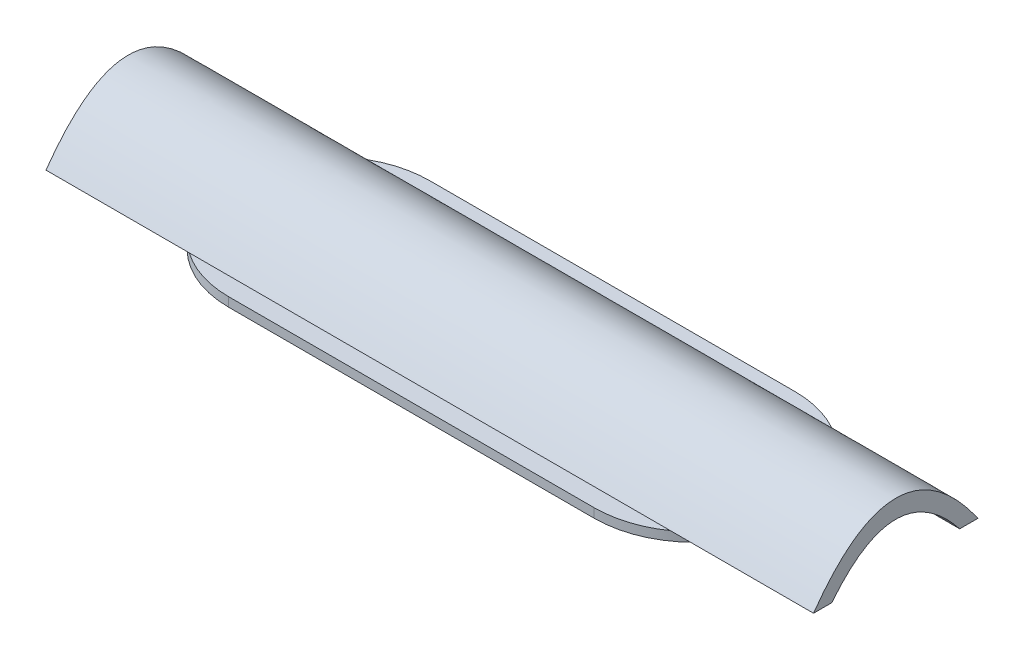
ISO-10303-21;
HEADER;
FILE_DESCRIPTION(('STEP AP214'),'2;1');
FILE_NAME('part.step','',(''),(''),'','','');
FILE_SCHEMA(('AUTOMOTIVE_DESIGN { 1 0 10303 214 1 1 1 1 }'));
ENDSEC;
DATA;
#1=APPLICATION_CONTEXT('core data for automotive mechanical design processes');
#2=APPLICATION_PROTOCOL_DEFINITION('international standard','automotive_design',2000,#1);
#3=PRODUCT_CONTEXT('',#1,'mechanical');
#4=PRODUCT('Part','Part','',(#3));
#5=PRODUCT_RELATED_PRODUCT_CATEGORY('part','',(#4));
#6=PRODUCT_DEFINITION_FORMATION('','',#4);
#7=PRODUCT_DEFINITION_CONTEXT('part definition',#1,'design');
#8=PRODUCT_DEFINITION('design','',#6,#7);
#9=PRODUCT_DEFINITION_SHAPE('','',#8);
#10=(LENGTH_UNIT() NAMED_UNIT(*) SI_UNIT(.MILLI.,.METRE.));
#11=(NAMED_UNIT(*) PLANE_ANGLE_UNIT() SI_UNIT($,.RADIAN.));
#12=(NAMED_UNIT(*) SI_UNIT($,.STERADIAN.) SOLID_ANGLE_UNIT());
#13=UNCERTAINTY_MEASURE_WITH_UNIT(LENGTH_MEASURE(1.E-05),#10,'distance_accuracy_value','');
#14=(GEOMETRIC_REPRESENTATION_CONTEXT(3) GLOBAL_UNCERTAINTY_ASSIGNED_CONTEXT((#13)) GLOBAL_UNIT_ASSIGNED_CONTEXT((#10,
#11,#12)) REPRESENTATION_CONTEXT('',''));
#15=CARTESIAN_POINT('',(0.,0.,0.));
#16=DIRECTION('',(0.,0.,1.));
#17=DIRECTION('',(1.,0.,0.));
#18=AXIS2_PLACEMENT_3D('',#15,#16,#17);
#19=CARTESIAN_POINT('',(-10.,0.5,0.));
#20=DIRECTION('',(0.,1.,0.));
#21=DIRECTION('',(0.,0.,1.));
#22=AXIS2_PLACEMENT_3D('',#19,#20,#21);
#23=PLANE('',#22);
#24=CARTESIAN_POINT('',(-10.,0.5,0.));
#25=DIRECTION('',(0.,1.,0.));
#26=DIRECTION('',(0.,0.,1.));
#27=AXIS2_PLACEMENT_3D('',#24,#25,#26);
#28=CIRCLE('',#27,5.5);
#29=CARTESIAN_POINT('',(-14.2426406871193,0.5,-3.5));
#30=VERTEX_POINT('',#29);
#31=CARTESIAN_POINT('',(-14.2426406871193,0.5,3.5));
#32=VERTEX_POINT('',#31);
#33=EDGE_CURVE('E319',#30,#32,#28,.T.);
#34=ORIENTED_EDGE('',*,*,#33,.T.);
#35=DIRECTION('',(1.,0.,0.));
#36=VECTOR('',#35,1.);
#37=CARTESIAN_POINT('',(-10.,0.5,3.5));
#38=LINE('',#37,#36);
#39=CARTESIAN_POINT('',(14.2426406871193,0.5,3.5));
#40=VERTEX_POINT('',#39);
#41=EDGE_CURVE('E409',#32,#40,#38,.T.);
#42=ORIENTED_EDGE('',*,*,#41,.T.);
#43=CARTESIAN_POINT('',(10.,0.5,0.));
#44=DIRECTION('',(0.,1.,0.));
#45=DIRECTION('',(0.,0.,1.));
#46=AXIS2_PLACEMENT_3D('',#43,#44,#45);
#47=CIRCLE('',#46,5.5);
#48=CARTESIAN_POINT('',(14.2426406871193,0.5,-3.5));
#49=VERTEX_POINT('',#48);
#50=EDGE_CURVE('E433',#40,#49,#47,.T.);
#51=ORIENTED_EDGE('',*,*,#50,.T.);
#52=DIRECTION('',(-1.,0.,0.));
#53=VECTOR('',#52,1.);
#54=CARTESIAN_POINT('',(-10.,0.5,-3.5));
#55=LINE('',#54,#53);
#56=EDGE_CURVE('E411',#49,#30,#55,.T.);
#57=ORIENTED_EDGE('',*,*,#56,.T.);
#58=EDGE_LOOP('',(#34,#42,#51,#57));
#59=FACE_BOUND('',#58,.T.);
#60=DIRECTION('',(-1.,0.,0.));
#61=VECTOR('',#60,1.);
#62=CARTESIAN_POINT('',(-10.,0.5,2.5));
#63=LINE('',#62,#61);
#64=CARTESIAN_POINT('',(10.,0.5,2.5));
#65=VERTEX_POINT('',#64);
#66=CARTESIAN_POINT('',(-10.,0.5,2.5));
#67=VERTEX_POINT('',#66);
#68=EDGE_CURVE('E197',#65,#67,#63,.T.);
#69=ORIENTED_EDGE('',*,*,#68,.T.);
#70=CARTESIAN_POINT('',(-10.,0.5,0.));
#71=DIRECTION('',(0.,-1.,0.));
#72=DIRECTION('',(0.,0.,-1.));
#73=AXIS2_PLACEMENT_3D('',#70,#71,#72);
#74=CIRCLE('',#73,2.5);
#75=CARTESIAN_POINT('',(-10.,0.5,-2.5));
#76=VERTEX_POINT('',#75);
#77=EDGE_CURVE('E227',#67,#76,#74,.T.);
#78=ORIENTED_EDGE('',*,*,#77,.T.);
#79=DIRECTION('',(1.,0.,0.));
#80=VECTOR('',#79,1.);
#81=CARTESIAN_POINT('',(-10.,0.5,-2.5));
#82=LINE('',#81,#80);
#83=CARTESIAN_POINT('',(10.,0.5,-2.49999999999999));
#84=VERTEX_POINT('',#83);
#85=EDGE_CURVE('E192',#76,#84,#82,.T.);
#86=ORIENTED_EDGE('',*,*,#85,.T.);
#87=CARTESIAN_POINT('',(10.,0.5,0.));
#88=DIRECTION('',(0.,-1.,0.));
#89=DIRECTION('',(0.,0.,-1.));
#90=AXIS2_PLACEMENT_3D('',#87,#88,#89);
#91=CIRCLE('',#90,2.5);
#92=EDGE_CURVE('E230',#84,#65,#91,.T.);
#93=ORIENTED_EDGE('',*,*,#92,.T.);
#94=EDGE_LOOP('',(#69,#78,#86,#93));
#95=FACE_BOUND('',#94,.T.);
#96=ADVANCED_FACE('F35',(#59,#95),#23,.T.);
#97=DIRECTION('',(1.,0.,0.));
#98=VECTOR('',#97,1.);
#99=CARTESIAN_POINT('',(-21.,0.5,-4.5));
#100=LINE('',#99,#98);
#101=CARTESIAN_POINT('',(-13.1622776601684,0.5,-4.5));
#102=VERTEX_POINT('',#101);
#103=CARTESIAN_POINT('',(13.1622776601684,0.5,-4.5));
#104=VERTEX_POINT('',#103);
#105=EDGE_CURVE('E392',#102,#104,#100,.T.);
#106=ORIENTED_EDGE('',*,*,#105,.T.);
#107=CARTESIAN_POINT('',(10.,0.5,-5.5));
#108=VERTEX_POINT('',#107);
#109=EDGE_CURVE('E429',#104,#108,#47,.T.);
#110=ORIENTED_EDGE('',*,*,#109,.T.);
#111=DIRECTION('',(-1.,0.,0.));
#112=VECTOR('',#111,1.);
#113=CARTESIAN_POINT('',(-10.,0.5,-5.5));
#114=LINE('',#113,#112);
#115=CARTESIAN_POINT('',(-10.,0.5,-5.5));
#116=VERTEX_POINT('',#115);
#117=EDGE_CURVE('E52',#108,#116,#114,.T.);
#118=ORIENTED_EDGE('',*,*,#117,.T.);
#119=EDGE_CURVE('E425',#116,#102,#28,.T.);
#120=ORIENTED_EDGE('',*,*,#119,.T.);
#121=EDGE_LOOP('',(#106,#110,#118,#120));
#122=FACE_BOUND('',#121,.T.);
#123=ADVANCED_FACE('F294',(#122),#23,.T.);
#124=DIRECTION('',(1.,0.,0.));
#125=VECTOR('',#124,1.);
#126=CARTESIAN_POINT('',(-21.,0.5,4.5));
#127=LINE('',#126,#125);
#128=CARTESIAN_POINT('',(-13.1622776601684,0.5,4.5));
#129=VERTEX_POINT('',#128);
#130=CARTESIAN_POINT('',(13.1622776601684,0.5,4.5));
#131=VERTEX_POINT('',#130);
#132=EDGE_CURVE('E387',#129,#131,#127,.T.);
#133=ORIENTED_EDGE('',*,*,#132,.F.);
#134=CARTESIAN_POINT('',(-10.,0.5,5.5));
#135=VERTEX_POINT('',#134);
#136=EDGE_CURVE('E84',#129,#135,#28,.T.);
#137=ORIENTED_EDGE('',*,*,#136,.T.);
#138=DIRECTION('',(1.,0.,0.));
#139=VECTOR('',#138,1.);
#140=CARTESIAN_POINT('',(-10.,0.5,5.5));
#141=LINE('',#140,#139);
#142=CARTESIAN_POINT('',(10.,0.5,5.5));
#143=VERTEX_POINT('',#142);
#144=EDGE_CURVE('E427',#135,#143,#141,.T.);
#145=ORIENTED_EDGE('',*,*,#144,.T.);
#146=EDGE_CURVE('E430',#143,#131,#47,.T.);
#147=ORIENTED_EDGE('',*,*,#146,.T.);
#148=EDGE_LOOP('',(#133,#137,#145,#147));
#149=FACE_BOUND('',#148,.T.);
#150=ADVANCED_FACE('F290',(#149),#23,.T.);
#151=CARTESIAN_POINT('',(-10.,0.,0.));
#152=DIRECTION('',(0.,1.,0.));
#153=DIRECTION('',(0.,0.,1.));
#154=AXIS2_PLACEMENT_3D('',#151,#152,#153);
#155=PLANE('',#154);
#156=CARTESIAN_POINT('',(-10.,0.,0.));
#157=DIRECTION('',(0.,1.,0.));
#158=DIRECTION('',(0.,0.,1.));
#159=AXIS2_PLACEMENT_3D('',#156,#157,#158);
#160=CIRCLE('',#159,5.5);
#161=CARTESIAN_POINT('',(-10.,0.,-5.5));
#162=VERTEX_POINT('',#161);
#163=CARTESIAN_POINT('',(-10.,0.,5.5));
#164=VERTEX_POINT('',#163);
#165=EDGE_CURVE('E414',#162,#164,#160,.T.);
#166=ORIENTED_EDGE('',*,*,#165,.F.);
#167=DIRECTION('',(-1.,0.,0.));
#168=VECTOR('',#167,1.);
#169=CARTESIAN_POINT('',(-10.,0.,-5.5));
#170=LINE('',#169,#168);
#171=CARTESIAN_POINT('',(10.,0.,-5.5));
#172=VERTEX_POINT('',#171);
#173=EDGE_CURVE('E76',#172,#162,#170,.T.);
#174=ORIENTED_EDGE('',*,*,#173,.F.);
#175=CARTESIAN_POINT('',(10.,0.,0.));
#176=DIRECTION('',(0.,1.,0.));
#177=DIRECTION('',(0.,0.,1.));
#178=AXIS2_PLACEMENT_3D('',#175,#176,#177);
#179=CIRCLE('',#178,5.5);
#180=CARTESIAN_POINT('',(10.,0.,5.5));
#181=VERTEX_POINT('',#180);
#182=EDGE_CURVE('E70',#181,#172,#179,.T.);
#183=ORIENTED_EDGE('',*,*,#182,.F.);
#184=DIRECTION('',(1.,0.,0.));
#185=VECTOR('',#184,1.);
#186=CARTESIAN_POINT('',(-10.,0.,5.5));
#187=LINE('',#186,#185);
#188=EDGE_CURVE('E438',#164,#181,#187,.T.);
#189=ORIENTED_EDGE('',*,*,#188,.F.);
#190=EDGE_LOOP('',(#166,#174,#183,#189));
#191=FACE_BOUND('',#190,.T.);
#192=CARTESIAN_POINT('',(-10.,0.,0.));
#193=DIRECTION('',(0.,1.,0.));
#194=DIRECTION('',(0.,0.,1.));
#195=AXIS2_PLACEMENT_3D('',#192,#193,#194);
#196=CIRCLE('',#195,3.5);
#197=CARTESIAN_POINT('',(-10.,0.,-3.50000000000001));
#198=VERTEX_POINT('',#197);
#199=CARTESIAN_POINT('',(-10.,0.,3.50000000000001));
#200=VERTEX_POINT('',#199);
#201=EDGE_CURVE('E408',#198,#200,#196,.T.);
#202=ORIENTED_EDGE('',*,*,#201,.T.);
#203=DIRECTION('',(1.,0.,0.));
#204=VECTOR('',#203,1.);
#205=CARTESIAN_POINT('',(-10.,0.,3.5));
#206=LINE('',#205,#204);
#207=CARTESIAN_POINT('',(10.,0.,3.5));
#208=VERTEX_POINT('',#207);
#209=EDGE_CURVE('E417',#200,#208,#206,.T.);
#210=ORIENTED_EDGE('',*,*,#209,.T.);
#211=CARTESIAN_POINT('',(10.,0.,0.));
#212=DIRECTION('',(0.,1.,0.));
#213=DIRECTION('',(0.,0.,1.));
#214=AXIS2_PLACEMENT_3D('',#211,#212,#213);
#215=CIRCLE('',#214,3.5);
#216=CARTESIAN_POINT('',(10.,0.,-3.50000000000001));
#217=VERTEX_POINT('',#216);
#218=EDGE_CURVE('E420',#208,#217,#215,.T.);
#219=ORIENTED_EDGE('',*,*,#218,.T.);
#220=DIRECTION('',(-1.,0.,0.));
#221=VECTOR('',#220,1.);
#222=CARTESIAN_POINT('',(-10.,0.,-3.5));
#223=LINE('',#222,#221);
#224=EDGE_CURVE('E412',#217,#198,#223,.T.);
#225=ORIENTED_EDGE('',*,*,#224,.T.);
#226=EDGE_LOOP('',(#202,#210,#219,#225));
#227=FACE_BOUND('',#226,.T.);
#228=ADVANCED_FACE('F293',(#191,#227),#155,.F.);
#229=CARTESIAN_POINT('',(-10.,0.5,0.));
#230=DIRECTION('',(0.,-1.,0.));
#231=DIRECTION('',(0.,0.,-1.));
#232=AXIS2_PLACEMENT_3D('',#229,#230,#231);
#233=CYLINDRICAL_SURFACE('',#232,5.5);
#234=ORIENTED_EDGE('',*,*,#165,.T.);
#235=DIRECTION('',(0.,-1.,0.));
#236=VECTOR('',#235,1.);
#237=CARTESIAN_POINT('',(-10.,0.5,5.5));
#238=LINE('',#237,#236);
#239=EDGE_CURVE('E11',#135,#164,#238,.T.);
#240=ORIENTED_EDGE('',*,*,#239,.F.);
#241=ORIENTED_EDGE('',*,*,#136,.F.);
#242=CARTESIAN_POINT('',(-10.,0.5,0.));
#243=DIRECTION('',(0.,-1.,0.));
#244=DIRECTION('',(0.,0.,-1.));
#245=AXIS2_PLACEMENT_3D('',#242,#243,#244);
#246=CIRCLE('',#245,5.5);
#247=EDGE_CURVE('E405',#129,#32,#246,.T.);
#248=ORIENTED_EDGE('',*,*,#247,.T.);
#249=ORIENTED_EDGE('',*,*,#33,.F.);
#250=CARTESIAN_POINT('',(-10.,0.5,0.));
#251=DIRECTION('',(0.,-1.,0.));
#252=DIRECTION('',(0.,0.,-1.));
#253=AXIS2_PLACEMENT_3D('',#250,#251,#252);
#254=CIRCLE('',#253,5.5);
#255=EDGE_CURVE('E399',#30,#102,#254,.T.);
#256=ORIENTED_EDGE('',*,*,#255,.T.);
#257=ORIENTED_EDGE('',*,*,#119,.F.);
#258=DIRECTION('',(0.,-1.,0.));
#259=VECTOR('',#258,1.);
#260=CARTESIAN_POINT('',(-10.,0.5,-5.5));
#261=LINE('',#260,#259);
#262=EDGE_CURVE('E435',#116,#162,#261,.T.);
#263=ORIENTED_EDGE('',*,*,#262,.T.);
#264=EDGE_LOOP('',(#234,#240,#241,#248,#249,#256,#257,#263));
#265=FACE_BOUND('',#264,.T.);
#266=ADVANCED_FACE('F37',(#265),#233,.T.);
#267=CARTESIAN_POINT('',(-10.,0.5,5.5));
#268=DIRECTION('',(0.,0.,-1.));
#269=DIRECTION('',(-1.,0.,0.));
#270=AXIS2_PLACEMENT_3D('',#267,#268,#269);
#271=PLANE('',#270);
#272=ORIENTED_EDGE('',*,*,#188,.T.);
#273=DIRECTION('',(0.,-1.,0.));
#274=VECTOR('',#273,1.);
#275=CARTESIAN_POINT('',(10.,0.5,5.5));
#276=LINE('',#275,#274);
#277=EDGE_CURVE('E44',#143,#181,#276,.T.);
#278=ORIENTED_EDGE('',*,*,#277,.F.);
#279=ORIENTED_EDGE('',*,*,#144,.F.);
#280=ORIENTED_EDGE('',*,*,#239,.T.);
#281=EDGE_LOOP('',(#272,#278,#279,#280));
#282=FACE_BOUND('',#281,.T.);
#283=ADVANCED_FACE('F304',(#282),#271,.F.);
#284=CARTESIAN_POINT('',(10.,0.5,0.));
#285=DIRECTION('',(0.,-1.,0.));
#286=DIRECTION('',(0.,0.,-1.));
#287=AXIS2_PLACEMENT_3D('',#284,#285,#286);
#288=CYLINDRICAL_SURFACE('',#287,5.5);
#289=ORIENTED_EDGE('',*,*,#182,.T.);
#290=DIRECTION('',(0.,-1.,0.));
#291=VECTOR('',#290,1.);
#292=CARTESIAN_POINT('',(10.,0.5,-5.5));
#293=LINE('',#292,#291);
#294=EDGE_CURVE('E443',#108,#172,#293,.T.);
#295=ORIENTED_EDGE('',*,*,#294,.F.);
#296=ORIENTED_EDGE('',*,*,#109,.F.);
#297=CARTESIAN_POINT('',(10.,0.5,0.));
#298=DIRECTION('',(0.,-1.,0.));
#299=DIRECTION('',(0.,0.,-1.));
#300=AXIS2_PLACEMENT_3D('',#297,#298,#299);
#301=CIRCLE('',#300,5.5);
#302=EDGE_CURVE('E382',#104,#49,#301,.T.);
#303=ORIENTED_EDGE('',*,*,#302,.T.);
#304=ORIENTED_EDGE('',*,*,#50,.F.);
#305=CARTESIAN_POINT('',(10.,0.5,0.));
#306=DIRECTION('',(0.,-1.,0.));
#307=DIRECTION('',(0.,0.,-1.));
#308=AXIS2_PLACEMENT_3D('',#305,#306,#307);
#309=CIRCLE('',#308,5.5);
#310=EDGE_CURVE('E402',#40,#131,#309,.T.);
#311=ORIENTED_EDGE('',*,*,#310,.T.);
#312=ORIENTED_EDGE('',*,*,#146,.F.);
#313=ORIENTED_EDGE('',*,*,#277,.T.);
#314=EDGE_LOOP('',(#289,#295,#296,#303,#304,#311,#312,#313));
#315=FACE_BOUND('',#314,.T.);
#316=ADVANCED_FACE('F302',(#315),#288,.T.);
#317=CARTESIAN_POINT('',(-10.,0.5,-5.5));
#318=DIRECTION('',(0.,0.,1.));
#319=DIRECTION('',(1.,0.,0.));
#320=AXIS2_PLACEMENT_3D('',#317,#318,#319);
#321=PLANE('',#320);
#322=ORIENTED_EDGE('',*,*,#173,.T.);
#323=ORIENTED_EDGE('',*,*,#262,.F.);
#324=ORIENTED_EDGE('',*,*,#117,.F.);
#325=ORIENTED_EDGE('',*,*,#294,.T.);
#326=EDGE_LOOP('',(#322,#323,#324,#325));
#327=FACE_BOUND('',#326,.T.);
#328=ADVANCED_FACE('F298',(#327),#321,.F.);
#329=CARTESIAN_POINT('',(-21.,0.5,4.5));
#330=DIRECTION('',(0.,-1.,0.));
#331=DIRECTION('',(0.,0.,-1.));
#332=AXIS2_PLACEMENT_3D('',#329,#330,#331);
#333=PLANE('',#332);
#334=ORIENTED_EDGE('',*,*,#247,.F.);
#335=CARTESIAN_POINT('',(-21.,0.5,4.5));
#336=VERTEX_POINT('',#335);
#337=EDGE_CURVE('E384',#336,#129,#127,.T.);
#338=ORIENTED_EDGE('',*,*,#337,.F.);
#339=DIRECTION('',(0.,0.,-1.));
#340=VECTOR('',#339,1.);
#341=CARTESIAN_POINT('',(-21.,0.5,4.5));
#342=LINE('',#341,#340);
#343=CARTESIAN_POINT('',(-21.,0.5,3.5));
#344=VERTEX_POINT('',#343);
#345=EDGE_CURVE('E372',#336,#344,#342,.T.);
#346=ORIENTED_EDGE('',*,*,#345,.T.);
#347=DIRECTION('',(1.,0.,0.));
#348=VECTOR('',#347,1.);
#349=CARTESIAN_POINT('',(-21.,0.5,3.5));
#350=LINE('',#349,#348);
#351=EDGE_CURVE('E379',#344,#32,#350,.T.);
#352=ORIENTED_EDGE('',*,*,#351,.T.);
#353=EDGE_LOOP('',(#334,#338,#346,#352));
#354=FACE_BOUND('',#353,.T.);
#355=ADVANCED_FACE('F301',(#354),#333,.T.);
#356=CARTESIAN_POINT('',(-21.,0.5,-3.5));
#357=DIRECTION('',(0.,-1.,0.));
#358=DIRECTION('',(0.,0.,-1.));
#359=AXIS2_PLACEMENT_3D('',#356,#357,#358);
#360=PLANE('',#359);
#361=ORIENTED_EDGE('',*,*,#255,.F.);
#362=DIRECTION('',(1.,0.,0.));
#363=VECTOR('',#362,1.);
#364=CARTESIAN_POINT('',(-21.,0.5,-3.5));
#365=LINE('',#364,#363);
#366=CARTESIAN_POINT('',(-21.,0.5,-3.5));
#367=VERTEX_POINT('',#366);
#368=EDGE_CURVE('E394',#367,#30,#365,.T.);
#369=ORIENTED_EDGE('',*,*,#368,.F.);
#370=DIRECTION('',(0.,0.,-1.));
#371=VECTOR('',#370,1.);
#372=CARTESIAN_POINT('',(-21.,0.5,-3.5));
#373=LINE('',#372,#371);
#374=CARTESIAN_POINT('',(-21.,0.5,-4.5));
#375=VERTEX_POINT('',#374);
#376=EDGE_CURVE('E275',#367,#375,#373,.T.);
#377=ORIENTED_EDGE('',*,*,#376,.T.);
#378=EDGE_CURVE('E389',#375,#102,#100,.T.);
#379=ORIENTED_EDGE('',*,*,#378,.T.);
#380=EDGE_LOOP('',(#361,#369,#377,#379));
#381=FACE_BOUND('',#380,.T.);
#382=ADVANCED_FACE('F288',(#381),#360,.T.);
#383=ORIENTED_EDGE('',*,*,#302,.F.);
#384=CARTESIAN_POINT('',(21.,0.5,-4.5));
#385=VERTEX_POINT('',#384);
#386=EDGE_CURVE('E393',#104,#385,#100,.T.);
#387=ORIENTED_EDGE('',*,*,#386,.T.);
#388=DIRECTION('',(0.,0.,-1.));
#389=VECTOR('',#388,1.);
#390=CARTESIAN_POINT('',(21.,0.5,-3.5));
#391=LINE('',#390,#389);
#392=CARTESIAN_POINT('',(21.,0.5,-3.5));
#393=VERTEX_POINT('',#392);
#394=EDGE_CURVE('E252',#393,#385,#391,.T.);
#395=ORIENTED_EDGE('',*,*,#394,.F.);
#396=EDGE_CURVE('E378',#49,#393,#365,.T.);
#397=ORIENTED_EDGE('',*,*,#396,.F.);
#398=EDGE_LOOP('',(#383,#387,#395,#397));
#399=FACE_BOUND('',#398,.T.);
#400=ADVANCED_FACE('F286',(#399),#360,.T.);
#401=CARTESIAN_POINT('',(-21.,0.5,3.5));
#402=CARTESIAN_POINT('',(-21.,4.90672822005873,0.000733785995191863));
#403=CARTESIAN_POINT('',(-21.,0.5,-3.5));
#404=B_SPLINE_CURVE_WITH_KNOTS('',2,(#401,#402,#403),.UNSPECIFIED.,.F.,.F.,(3,3),(0.,1.),.UNSPECIFIED.);
#405=DIRECTION('',(1.,0.,0.));
#406=VECTOR('',#405,1.);
#407=SURFACE_OF_LINEAR_EXTRUSION('',#404,#406);
#408=ORIENTED_EDGE('',*,*,#368,.T.);
#409=ORIENTED_EDGE('',*,*,#56,.F.);
#410=ORIENTED_EDGE('',*,*,#396,.T.);
#411=CARTESIAN_POINT('',(21.,0.5,3.5));
#412=CARTESIAN_POINT('',(21.,4.90672822005873,0.000733785995191863));
#413=CARTESIAN_POINT('',(21.,0.5,-3.5));
#414=B_SPLINE_CURVE_WITH_KNOTS('',2,(#411,#412,#413),.UNSPECIFIED.,.F.,.F.,(3,3),(0.,1.),.UNSPECIFIED.);
#415=CARTESIAN_POINT('',(21.,0.5,3.5));
#416=VERTEX_POINT('',#415);
#417=EDGE_CURVE('E242',#416,#393,#414,.T.);
#418=ORIENTED_EDGE('',*,*,#417,.F.);
#419=EDGE_CURVE('E383',#40,#416,#350,.T.);
#420=ORIENTED_EDGE('',*,*,#419,.F.);
#421=ORIENTED_EDGE('',*,*,#41,.F.);
#422=ORIENTED_EDGE('',*,*,#351,.F.);
#423=EDGE_CURVE('E269',#344,#367,#404,.T.);
#424=ORIENTED_EDGE('',*,*,#423,.T.);
#425=EDGE_LOOP('',(#408,#409,#410,#418,#420,#421,#422,#424));
#426=FACE_BOUND('',#425,.T.);
#427=ADVANCED_FACE('F281',(#426),#407,.T.);
#428=ORIENTED_EDGE('',*,*,#310,.F.);
#429=ORIENTED_EDGE('',*,*,#419,.T.);
#430=DIRECTION('',(0.,0.,-1.));
#431=VECTOR('',#430,1.);
#432=CARTESIAN_POINT('',(21.,0.5,4.5));
#433=LINE('',#432,#431);
#434=CARTESIAN_POINT('',(21.,0.5,4.5));
#435=VERTEX_POINT('',#434);
#436=EDGE_CURVE('E263',#435,#416,#433,.T.);
#437=ORIENTED_EDGE('',*,*,#436,.F.);
#438=EDGE_CURVE('E388',#131,#435,#127,.T.);
#439=ORIENTED_EDGE('',*,*,#438,.F.);
#440=EDGE_LOOP('',(#428,#429,#437,#439));
#441=FACE_BOUND('',#440,.T.);
#442=ADVANCED_FACE('F285',(#441),#333,.T.);
#443=CARTESIAN_POINT('',(-21.,0.5,-4.5));
#444=CARTESIAN_POINT('',(-21.,6.90674136313797,-0.0104555936665669));
#445=CARTESIAN_POINT('',(-21.,0.5,4.5));
#446=B_SPLINE_CURVE_WITH_KNOTS('',2,(#443,#444,#445),.UNSPECIFIED.,.F.,.F.,(3,3),(0.,1.),.UNSPECIFIED.);
#447=DIRECTION('',(1.,0.,0.));
#448=VECTOR('',#447,1.);
#449=SURFACE_OF_LINEAR_EXTRUSION('',#446,#448);
#450=ORIENTED_EDGE('',*,*,#337,.T.);
#451=ORIENTED_EDGE('',*,*,#132,.T.);
#452=ORIENTED_EDGE('',*,*,#438,.T.);
#453=CARTESIAN_POINT('',(21.,0.5,-4.5));
#454=CARTESIAN_POINT('',(21.,6.90674136313797,-0.0104555936665669));
#455=CARTESIAN_POINT('',(21.,0.5,4.5));
#456=B_SPLINE_CURVE_WITH_KNOTS('',2,(#453,#454,#455),.UNSPECIFIED.,.F.,.F.,(3,3),(0.,1.),.UNSPECIFIED.);
#457=EDGE_CURVE('E258',#385,#435,#456,.T.);
#458=ORIENTED_EDGE('',*,*,#457,.F.);
#459=ORIENTED_EDGE('',*,*,#386,.F.);
#460=ORIENTED_EDGE('',*,*,#105,.F.);
#461=ORIENTED_EDGE('',*,*,#378,.F.);
#462=EDGE_CURVE('E366',#375,#336,#446,.T.);
#463=ORIENTED_EDGE('',*,*,#462,.T.);
#464=EDGE_LOOP('',(#450,#451,#452,#458,#459,#460,#461,#463));
#465=FACE_BOUND('',#464,.T.);
#466=ADVANCED_FACE('F360',(#465),#449,.T.);
#467=CARTESIAN_POINT('',(-21.,2.70336411002936,0.000366892997595916));
#468=DIRECTION('',(1.,0.,0.));
#469=DIRECTION('',(0.,0.,-1.));
#470=AXIS2_PLACEMENT_3D('',#467,#468,#469);
#471=PLANE('',#470);
#472=ORIENTED_EDGE('',*,*,#423,.F.);
#473=ORIENTED_EDGE('',*,*,#345,.F.);
#474=ORIENTED_EDGE('',*,*,#462,.F.);
#475=ORIENTED_EDGE('',*,*,#376,.F.);
#476=EDGE_LOOP('',(#472,#473,#474,#475));
#477=FACE_BOUND('',#476,.T.);
#478=ADVANCED_FACE('F356',(#477),#471,.F.);
#479=CARTESIAN_POINT('',(21.,2.70336411002936,0.000366892997595916));
#480=DIRECTION('',(1.,0.,0.));
#481=DIRECTION('',(0.,0.,-1.));
#482=AXIS2_PLACEMENT_3D('',#479,#480,#481);
#483=PLANE('',#482);
#484=ORIENTED_EDGE('',*,*,#417,.T.);
#485=ORIENTED_EDGE('',*,*,#394,.T.);
#486=ORIENTED_EDGE('',*,*,#457,.T.);
#487=ORIENTED_EDGE('',*,*,#436,.T.);
#488=EDGE_LOOP('',(#484,#485,#486,#487));
#489=FACE_BOUND('',#488,.T.);
#490=ADVANCED_FACE('F352',(#489),#483,.T.);
#491=CARTESIAN_POINT('',(10.,0.5,0.));
#492=DIRECTION('',(0.,-1.,0.));
#493=DIRECTION('',(0.,0.,-1.));
#494=AXIS2_PLACEMENT_3D('',#491,#492,#493);
#495=CYLINDRICAL_SURFACE('',#494,3.5);
#496=ORIENTED_EDGE('',*,*,#218,.F.);
#497=DIRECTION('',(0.,-1.,0.));
#498=VECTOR('',#497,1.);
#499=CARTESIAN_POINT('',(10.,0.5,3.5));
#500=LINE('',#499,#498);
#501=CARTESIAN_POINT('',(10.,-1.,3.5));
#502=VERTEX_POINT('',#501);
#503=EDGE_CURVE('E236',#208,#502,#500,.T.);
#504=ORIENTED_EDGE('',*,*,#503,.T.);
#505=CARTESIAN_POINT('',(10.,-1.,0.));
#506=DIRECTION('',(0.,-1.,0.));
#507=DIRECTION('',(0.,0.,-1.));
#508=AXIS2_PLACEMENT_3D('',#505,#506,#507);
#509=CIRCLE('',#508,3.5);
#510=CARTESIAN_POINT('',(10.,-1.,-3.50000000000001));
#511=VERTEX_POINT('',#510);
#512=EDGE_CURVE('E215',#511,#502,#509,.T.);
#513=ORIENTED_EDGE('',*,*,#512,.F.);
#514=DIRECTION('',(0.,-1.,0.));
#515=VECTOR('',#514,1.);
#516=CARTESIAN_POINT('',(10.,0.5,-3.50000000000001));
#517=LINE('',#516,#515);
#518=EDGE_CURVE('E240',#217,#511,#517,.T.);
#519=ORIENTED_EDGE('',*,*,#518,.F.);
#520=EDGE_LOOP('',(#496,#504,#513,#519));
#521=FACE_BOUND('',#520,.T.);
#522=ADVANCED_FACE('F342',(#521),#495,.T.);
#523=CARTESIAN_POINT('',(10.,0.5,-3.50000000000001));
#524=DIRECTION('',(0.,0.,-1.));
#525=DIRECTION('',(-1.,0.,0.));
#526=AXIS2_PLACEMENT_3D('',#523,#524,#525);
#527=PLANE('',#526);
#528=ORIENTED_EDGE('',*,*,#224,.F.);
#529=ORIENTED_EDGE('',*,*,#518,.T.);
#530=DIRECTION('',(1.,0.,0.));
#531=VECTOR('',#530,1.);
#532=CARTESIAN_POINT('',(10.,-1.,-3.50000000000001));
#533=LINE('',#532,#531);
#534=CARTESIAN_POINT('',(-10.,-1.,-3.50000000000001));
#535=VERTEX_POINT('',#534);
#536=EDGE_CURVE('E224',#535,#511,#533,.T.);
#537=ORIENTED_EDGE('',*,*,#536,.F.);
#538=DIRECTION('',(0.,-1.,0.));
#539=VECTOR('',#538,1.);
#540=CARTESIAN_POINT('',(-10.,0.5,-3.50000000000001));
#541=LINE('',#540,#539);
#542=EDGE_CURVE('E243',#198,#535,#541,.T.);
#543=ORIENTED_EDGE('',*,*,#542,.F.);
#544=EDGE_LOOP('',(#528,#529,#537,#543));
#545=FACE_BOUND('',#544,.T.);
#546=ADVANCED_FACE('F338',(#545),#527,.T.);
#547=CARTESIAN_POINT('',(-10.,0.5,0.));
#548=DIRECTION('',(0.,-1.,0.));
#549=DIRECTION('',(0.,0.,-1.));
#550=AXIS2_PLACEMENT_3D('',#547,#548,#549);
#551=CYLINDRICAL_SURFACE('',#550,3.5);
#552=ORIENTED_EDGE('',*,*,#201,.F.);
#553=ORIENTED_EDGE('',*,*,#542,.T.);
#554=CARTESIAN_POINT('',(-10.,-1.,0.));
#555=DIRECTION('',(0.,-1.,0.));
#556=DIRECTION('',(0.,0.,-1.));
#557=AXIS2_PLACEMENT_3D('',#554,#555,#556);
#558=CIRCLE('',#557,3.5);
#559=CARTESIAN_POINT('',(-10.,-1.,3.50000000000001));
#560=VERTEX_POINT('',#559);
#561=EDGE_CURVE('E221',#560,#535,#558,.T.);
#562=ORIENTED_EDGE('',*,*,#561,.F.);
#563=DIRECTION('',(0.,-1.,0.));
#564=VECTOR('',#563,1.);
#565=CARTESIAN_POINT('',(-10.,0.5,3.50000000000001));
#566=LINE('',#565,#564);
#567=EDGE_CURVE('E245',#200,#560,#566,.T.);
#568=ORIENTED_EDGE('',*,*,#567,.F.);
#569=EDGE_LOOP('',(#552,#553,#562,#568));
#570=FACE_BOUND('',#569,.T.);
#571=ADVANCED_FACE('F341',(#570),#551,.T.);
#572=CARTESIAN_POINT('',(10.,0.5,3.5));
#573=DIRECTION('',(0.,0.,1.));
#574=DIRECTION('',(1.,0.,0.));
#575=AXIS2_PLACEMENT_3D('',#572,#573,#574);
#576=PLANE('',#575);
#577=ORIENTED_EDGE('',*,*,#209,.F.);
#578=ORIENTED_EDGE('',*,*,#567,.T.);
#579=DIRECTION('',(-1.,0.,0.));
#580=VECTOR('',#579,1.);
#581=CARTESIAN_POINT('',(10.,-1.,3.5));
#582=LINE('',#581,#580);
#583=EDGE_CURVE('E218',#502,#560,#582,.T.);
#584=ORIENTED_EDGE('',*,*,#583,.F.);
#585=ORIENTED_EDGE('',*,*,#503,.F.);
#586=EDGE_LOOP('',(#577,#578,#584,#585));
#587=FACE_BOUND('',#586,.T.);
#588=ADVANCED_FACE('F337',(#587),#576,.T.);
#589=CARTESIAN_POINT('',(-10.,0.5,0.));
#590=DIRECTION('',(0.,-1.,0.));
#591=DIRECTION('',(0.,0.,-1.));
#592=AXIS2_PLACEMENT_3D('',#589,#590,#591);
#593=CYLINDRICAL_SURFACE('',#592,2.5);
#594=DIRECTION('',(0.,-1.,0.));
#595=VECTOR('',#594,1.);
#596=CARTESIAN_POINT('',(-10.,0.5,2.5));
#597=LINE('',#596,#595);
#598=CARTESIAN_POINT('',(-10.,-1.,2.5));
#599=VERTEX_POINT('',#598);
#600=EDGE_CURVE('E202',#67,#599,#597,.T.);
#601=ORIENTED_EDGE('',*,*,#600,.T.);
#602=CARTESIAN_POINT('',(-10.,-1.,0.));
#603=DIRECTION('',(0.,-1.,0.));
#604=DIRECTION('',(0.,0.,-1.));
#605=AXIS2_PLACEMENT_3D('',#602,#603,#604);
#606=CIRCLE('',#605,2.5);
#607=CARTESIAN_POINT('',(-10.,-1.,-2.5));
#608=VERTEX_POINT('',#607);
#609=EDGE_CURVE('E200',#599,#608,#606,.T.);
#610=ORIENTED_EDGE('',*,*,#609,.T.);
#611=DIRECTION('',(0.,-1.,0.));
#612=VECTOR('',#611,1.);
#613=CARTESIAN_POINT('',(-10.,0.5,-2.5));
#614=LINE('',#613,#612);
#615=EDGE_CURVE('E184',#76,#608,#614,.T.);
#616=ORIENTED_EDGE('',*,*,#615,.F.);
#617=ORIENTED_EDGE('',*,*,#77,.F.);
#618=EDGE_LOOP('',(#601,#610,#616,#617));
#619=FACE_BOUND('',#618,.T.);
#620=ADVANCED_FACE('F201',(#619),#593,.F.);
#621=CARTESIAN_POINT('',(-10.,0.5,2.5));
#622=DIRECTION('',(0.,0.,1.));
#623=DIRECTION('',(1.,0.,0.));
#624=AXIS2_PLACEMENT_3D('',#621,#622,#623);
#625=PLANE('',#624);
#626=DIRECTION('',(0.,-1.,0.));
#627=VECTOR('',#626,1.);
#628=CARTESIAN_POINT('',(10.,0.5,2.5));
#629=LINE('',#628,#627);
#630=CARTESIAN_POINT('',(10.,-1.,2.5));
#631=VERTEX_POINT('',#630);
#632=EDGE_CURVE('E237',#65,#631,#629,.T.);
#633=ORIENTED_EDGE('',*,*,#632,.T.);
#634=DIRECTION('',(-1.,0.,0.));
#635=VECTOR('',#634,1.);
#636=CARTESIAN_POINT('',(-10.,-1.,2.5));
#637=LINE('',#636,#635);
#638=EDGE_CURVE('E211',#631,#599,#637,.T.);
#639=ORIENTED_EDGE('',*,*,#638,.T.);
#640=ORIENTED_EDGE('',*,*,#600,.F.);
#641=ORIENTED_EDGE('',*,*,#68,.F.);
#642=EDGE_LOOP('',(#633,#639,#640,#641));
#643=FACE_BOUND('',#642,.T.);
#644=ADVANCED_FACE('F322',(#643),#625,.F.);
#645=CARTESIAN_POINT('',(10.,0.5,0.));
#646=DIRECTION('',(0.,-1.,0.));
#647=DIRECTION('',(0.,0.,-1.));
#648=AXIS2_PLACEMENT_3D('',#645,#646,#647);
#649=CYLINDRICAL_SURFACE('',#648,2.5);
#650=DIRECTION('',(0.,-1.,0.));
#651=VECTOR('',#650,1.);
#652=CARTESIAN_POINT('',(10.,0.5,-2.49999999999999));
#653=LINE('',#652,#651);
#654=CARTESIAN_POINT('',(10.,-1.,-2.49999999999999));
#655=VERTEX_POINT('',#654);
#656=EDGE_CURVE('E196',#84,#655,#653,.T.);
#657=ORIENTED_EDGE('',*,*,#656,.T.);
#658=CARTESIAN_POINT('',(10.,-1.,0.));
#659=DIRECTION('',(0.,-1.,0.));
#660=DIRECTION('',(0.,0.,-1.));
#661=AXIS2_PLACEMENT_3D('',#658,#659,#660);
#662=CIRCLE('',#661,2.5);
#663=EDGE_CURVE('E209',#655,#631,#662,.T.);
#664=ORIENTED_EDGE('',*,*,#663,.T.);
#665=ORIENTED_EDGE('',*,*,#632,.F.);
#666=ORIENTED_EDGE('',*,*,#92,.F.);
#667=EDGE_LOOP('',(#657,#664,#665,#666));
#668=FACE_BOUND('',#667,.T.);
#669=ADVANCED_FACE('F324',(#668),#649,.F.);
#670=CARTESIAN_POINT('',(-10.,0.5,-2.5));
#671=DIRECTION('',(0.,0.,-1.));
#672=DIRECTION('',(-1.,0.,0.));
#673=AXIS2_PLACEMENT_3D('',#670,#671,#672);
#674=PLANE('',#673);
#675=ORIENTED_EDGE('',*,*,#615,.T.);
#676=DIRECTION('',(1.,0.,0.));
#677=VECTOR('',#676,1.);
#678=CARTESIAN_POINT('',(-10.,-1.,-2.5));
#679=LINE('',#678,#677);
#680=EDGE_CURVE('E189',#608,#655,#679,.T.);
#681=ORIENTED_EDGE('',*,*,#680,.T.);
#682=ORIENTED_EDGE('',*,*,#656,.F.);
#683=ORIENTED_EDGE('',*,*,#85,.F.);
#684=EDGE_LOOP('',(#675,#681,#682,#683));
#685=FACE_BOUND('',#684,.T.);
#686=ADVANCED_FACE('F186',(#685),#674,.F.);
#687=CARTESIAN_POINT('',(10.,-1.,0.));
#688=DIRECTION('',(0.,-1.,0.));
#689=DIRECTION('',(0.,0.,-1.));
#690=AXIS2_PLACEMENT_3D('',#687,#688,#689);
#691=PLANE('',#690);
#692=ORIENTED_EDGE('',*,*,#512,.T.);
#693=ORIENTED_EDGE('',*,*,#583,.T.);
#694=ORIENTED_EDGE('',*,*,#561,.T.);
#695=ORIENTED_EDGE('',*,*,#536,.T.);
#696=EDGE_LOOP('',(#692,#693,#694,#695));
#697=FACE_BOUND('',#696,.T.);
#698=ORIENTED_EDGE('',*,*,#680,.F.);
#699=ORIENTED_EDGE('',*,*,#609,.F.);
#700=ORIENTED_EDGE('',*,*,#638,.F.);
#701=ORIENTED_EDGE('',*,*,#663,.F.);
#702=EDGE_LOOP('',(#698,#699,#700,#701));
#703=FACE_BOUND('',#702,.T.);
#704=ADVANCED_FACE('F207',(#697,#703),#691,.T.);
#705=CLOSED_SHELL('',(#96,#123,#150,#228,#266,#283,#316,#328,#355,#382,#400,#427,#442,#466,#478,
#490,#522,#546,#571,#588,#620,#644,#669,#686,#704));
#706=MANIFOLD_SOLID_BREP('B2',#705);
#707=ADVANCED_BREP_SHAPE_REPRESENTATION('',(#18,#706),#14);
#708=SHAPE_DEFINITION_REPRESENTATION(#9,#707);
ENDSEC;
END-ISO-10303-21;
